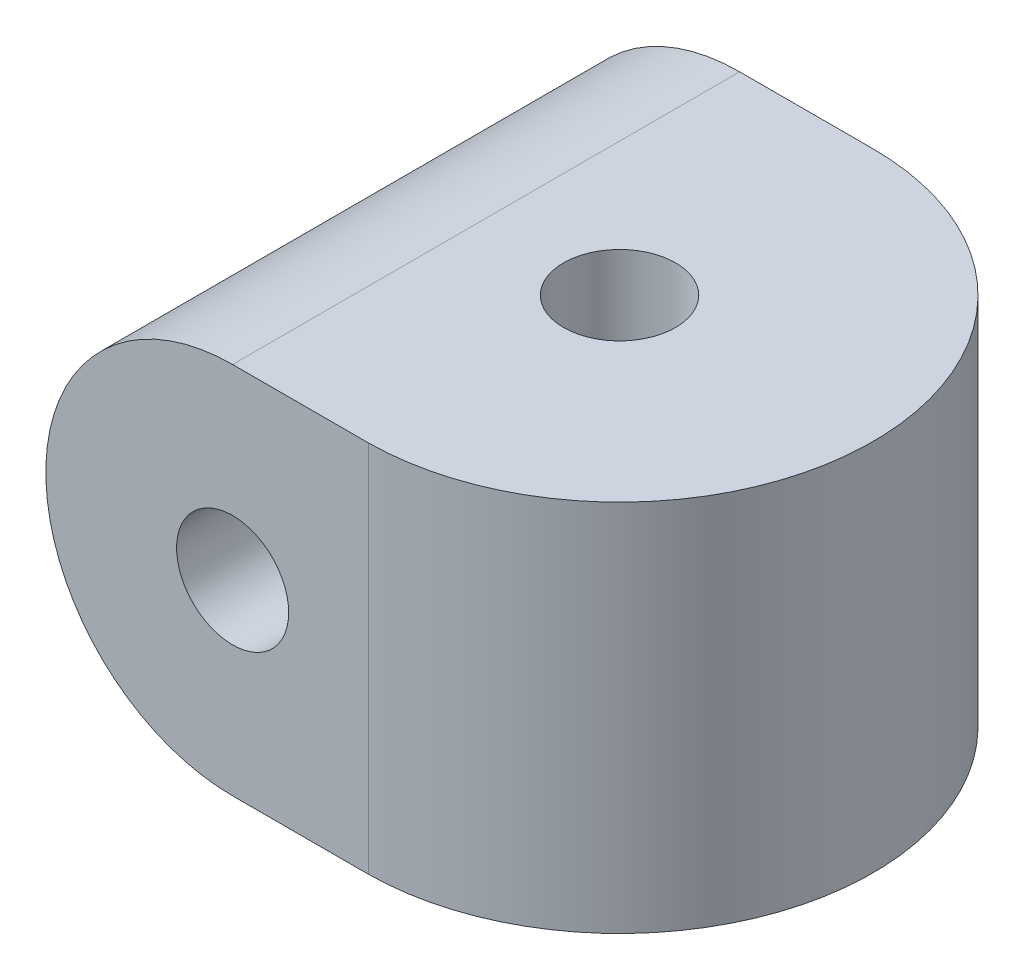
ISO-10303-21;
HEADER;
FILE_DESCRIPTION(('STEP AP214'),'2;1');
FILE_NAME('part.step','',(''),(''),'','','');
FILE_SCHEMA(('AUTOMOTIVE_DESIGN { 1 0 10303 214 1 1 1 1 }'));
ENDSEC;
DATA;
#1=APPLICATION_CONTEXT('core data for automotive mechanical design processes');
#2=APPLICATION_PROTOCOL_DEFINITION('international standard','automotive_design',2000,#1);
#3=PRODUCT_CONTEXT('',#1,'mechanical');
#4=PRODUCT('Part','Part','',(#3));
#5=PRODUCT_RELATED_PRODUCT_CATEGORY('part','',(#4));
#6=PRODUCT_DEFINITION_FORMATION('','',#4);
#7=PRODUCT_DEFINITION_CONTEXT('part definition',#1,'design');
#8=PRODUCT_DEFINITION('design','',#6,#7);
#9=PRODUCT_DEFINITION_SHAPE('','',#8);
#10=(LENGTH_UNIT() NAMED_UNIT(*) SI_UNIT(.MILLI.,.METRE.));
#11=(NAMED_UNIT(*) PLANE_ANGLE_UNIT() SI_UNIT($,.RADIAN.));
#12=(NAMED_UNIT(*) SI_UNIT($,.STERADIAN.) SOLID_ANGLE_UNIT());
#13=UNCERTAINTY_MEASURE_WITH_UNIT(LENGTH_MEASURE(1.E-05),#10,'distance_accuracy_value','');
#14=(GEOMETRIC_REPRESENTATION_CONTEXT(3) GLOBAL_UNCERTAINTY_ASSIGNED_CONTEXT((#13)) GLOBAL_UNIT_ASSIGNED_CONTEXT((#10,
#11,#12)) REPRESENTATION_CONTEXT('',''));
#15=CARTESIAN_POINT('',(0.,0.,0.));
#16=DIRECTION('',(0.,0.,1.));
#17=DIRECTION('',(1.,0.,0.));
#18=AXIS2_PLACEMENT_3D('',#15,#16,#17);
#19=CARTESIAN_POINT('',(0.,7.,0.));
#20=DIRECTION('',(0.,-1.,0.));
#21=DIRECTION('',(0.,0.,-1.));
#22=AXIS2_PLACEMENT_3D('',#19,#20,#21);
#23=PLANE('',#22);
#24=CARTESIAN_POINT('',(0.,7.,0.));
#25=DIRECTION('',(0.,1.,0.));
#26=DIRECTION('',(0.,0.,1.));
#27=AXIS2_PLACEMENT_3D('',#24,#25,#26);
#28=CIRCLE('',#27,2.1);
#29=CARTESIAN_POINT('',(0.,7.,2.1));
#30=VERTEX_POINT('',#29);
#31=EDGE_CURVE('E90',#30,#30,#28,.T.);
#32=ORIENTED_EDGE('',*,*,#31,.F.);
#33=EDGE_LOOP('',(#32));
#34=FACE_BOUND('',#33,.T.);
#35=DIRECTION('',(0.,0.,1.));
#36=VECTOR('',#35,1.);
#37=CARTESIAN_POINT('',(-5.,7.,-9.5));
#38=LINE('',#37,#36);
#39=CARTESIAN_POINT('',(-5.,7.,-9.5));
#40=VERTEX_POINT('',#39);
#41=CARTESIAN_POINT('',(-5.,7.,9.49962135554699));
#42=VERTEX_POINT('',#41);
#43=EDGE_CURVE('E110',#40,#42,#38,.T.);
#44=ORIENTED_EDGE('',*,*,#43,.T.);
#45=DIRECTION('',(1.,0.,0.));
#46=VECTOR('',#45,1.);
#47=CARTESIAN_POINT('',(-15.,7.,9.49962135554699));
#48=LINE('',#47,#46);
#49=CARTESIAN_POINT('',(0.0848180478173785,7.,9.49962135554699));
#50=VERTEX_POINT('',#49);
#51=EDGE_CURVE('E61',#42,#50,#48,.T.);
#52=ORIENTED_EDGE('',*,*,#51,.T.);
#53=CARTESIAN_POINT('',(0.,7.,0.));
#54=DIRECTION('',(0.,1.,0.));
#55=DIRECTION('',(0.,0.,-1.));
#56=AXIS2_PLACEMENT_3D('',#53,#54,#55);
#57=CIRCLE('',#56,9.5);
#58=CARTESIAN_POINT('',(0.,7.,-9.5));
#59=VERTEX_POINT('',#58);
#60=EDGE_CURVE('E81',#50,#59,#57,.T.);
#61=ORIENTED_EDGE('',*,*,#60,.T.);
#62=DIRECTION('',(-1.,0.,0.));
#63=VECTOR('',#62,1.);
#64=CARTESIAN_POINT('',(0.,7.,-9.5));
#65=LINE('',#64,#63);
#66=EDGE_CURVE('E98',#59,#40,#65,.T.);
#67=ORIENTED_EDGE('',*,*,#66,.T.);
#68=EDGE_LOOP('',(#44,#52,#61,#67));
#69=FACE_BOUND('',#68,.T.);
#70=ADVANCED_FACE('F37',(#34,#69),#23,.F.);
#71=CARTESIAN_POINT('',(0.,-7.,0.));
#72=DIRECTION('',(0.,-1.,0.));
#73=DIRECTION('',(0.,0.,-1.));
#74=AXIS2_PLACEMENT_3D('',#71,#72,#73);
#75=PLANE('',#74);
#76=CARTESIAN_POINT('',(0.,-7.,0.));
#77=DIRECTION('',(0.,1.,0.));
#78=DIRECTION('',(0.,0.,1.));
#79=AXIS2_PLACEMENT_3D('',#76,#77,#78);
#80=CIRCLE('',#79,2.1);
#81=CARTESIAN_POINT('',(0.,-7.,2.1));
#82=VERTEX_POINT('',#81);
#83=EDGE_CURVE('E94',#82,#82,#80,.T.);
#84=ORIENTED_EDGE('',*,*,#83,.T.);
#85=EDGE_LOOP('',(#84));
#86=FACE_BOUND('',#85,.T.);
#87=DIRECTION('',(1.,0.,0.));
#88=VECTOR('',#87,1.);
#89=CARTESIAN_POINT('',(-15.,-7.,9.49962135554699));
#90=LINE('',#89,#88);
#91=CARTESIAN_POINT('',(-5.,-7.,9.49962135554699));
#92=VERTEX_POINT('',#91);
#93=CARTESIAN_POINT('',(0.0848180478173785,-7.,9.49962135554699));
#94=VERTEX_POINT('',#93);
#95=EDGE_CURVE('E74',#92,#94,#90,.T.);
#96=ORIENTED_EDGE('',*,*,#95,.F.);
#97=DIRECTION('',(0.,0.,1.));
#98=VECTOR('',#97,1.);
#99=CARTESIAN_POINT('',(-5.,-7.,-9.5));
#100=LINE('',#99,#98);
#101=CARTESIAN_POINT('',(-5.,-7.,-9.5));
#102=VERTEX_POINT('',#101);
#103=EDGE_CURVE('E52',#102,#92,#100,.T.);
#104=ORIENTED_EDGE('',*,*,#103,.F.);
#105=DIRECTION('',(-1.,0.,0.));
#106=VECTOR('',#105,1.);
#107=CARTESIAN_POINT('',(0.,-7.,-9.5));
#108=LINE('',#107,#106);
#109=CARTESIAN_POINT('',(0.,-7.,-9.5));
#110=VERTEX_POINT('',#109);
#111=EDGE_CURVE('E82',#110,#102,#108,.T.);
#112=ORIENTED_EDGE('',*,*,#111,.F.);
#113=CARTESIAN_POINT('',(0.,-7.,0.));
#114=DIRECTION('',(0.,1.,0.));
#115=DIRECTION('',(0.,0.,-1.));
#116=AXIS2_PLACEMENT_3D('',#113,#114,#115);
#117=CIRCLE('',#116,9.5);
#118=EDGE_CURVE('E87',#94,#110,#117,.T.);
#119=ORIENTED_EDGE('',*,*,#118,.F.);
#120=EDGE_LOOP('',(#96,#104,#112,#119));
#121=FACE_BOUND('',#120,.T.);
#122=ADVANCED_FACE('F88',(#86,#121),#75,.T.);
#123=CARTESIAN_POINT('',(0.,7.,0.));
#124=DIRECTION('',(0.,-1.,0.));
#125=DIRECTION('',(0.,0.,-1.));
#126=AXIS2_PLACEMENT_3D('',#123,#124,#125);
#127=CYLINDRICAL_SURFACE('',#126,9.5);
#128=ORIENTED_EDGE('',*,*,#118,.T.);
#129=DIRECTION('',(0.,-1.,0.));
#130=VECTOR('',#129,1.);
#131=CARTESIAN_POINT('',(0.,7.,-9.5));
#132=LINE('',#131,#130);
#133=EDGE_CURVE('E11',#59,#110,#132,.T.);
#134=ORIENTED_EDGE('',*,*,#133,.F.);
#135=ORIENTED_EDGE('',*,*,#60,.F.);
#136=DIRECTION('',(0.,-1.,0.));
#137=VECTOR('',#136,1.);
#138=CARTESIAN_POINT('',(0.0848180478173785,7.,9.49962135554699));
#139=LINE('',#138,#137);
#140=EDGE_CURVE('E45',#50,#94,#139,.T.);
#141=ORIENTED_EDGE('',*,*,#140,.T.);
#142=EDGE_LOOP('',(#128,#134,#135,#141));
#143=FACE_BOUND('',#142,.T.);
#144=ADVANCED_FACE('F39',(#143),#127,.T.);
#145=CARTESIAN_POINT('',(0.,7.,-9.5));
#146=DIRECTION('',(0.,0.,1.));
#147=DIRECTION('',(1.,0.,0.));
#148=AXIS2_PLACEMENT_3D('',#145,#146,#147);
#149=PLANE('',#148);
#150=CARTESIAN_POINT('',(-5.,0.,-9.5));
#151=DIRECTION('',(0.,0.,1.));
#152=DIRECTION('',(1.,0.,0.));
#153=AXIS2_PLACEMENT_3D('',#150,#151,#152);
#154=CIRCLE('',#153,2.1);
#155=CARTESIAN_POINT('',(-2.9,0.,-9.5));
#156=VERTEX_POINT('',#155);
#157=EDGE_CURVE('E103',#156,#156,#154,.T.);
#158=ORIENTED_EDGE('',*,*,#157,.T.);
#159=EDGE_LOOP('',(#158));
#160=FACE_BOUND('',#159,.T.);
#161=ORIENTED_EDGE('',*,*,#111,.T.);
#162=CARTESIAN_POINT('',(-5.,0.,-9.5));
#163=DIRECTION('',(0.,0.,-1.));
#164=DIRECTION('',(1.,0.,0.));
#165=AXIS2_PLACEMENT_3D('',#162,#163,#164);
#166=CIRCLE('',#165,7.);
#167=EDGE_CURVE('E112',#102,#40,#166,.T.);
#168=ORIENTED_EDGE('',*,*,#167,.T.);
#169=ORIENTED_EDGE('',*,*,#66,.F.);
#170=ORIENTED_EDGE('',*,*,#133,.T.);
#171=EDGE_LOOP('',(#161,#168,#169,#170));
#172=FACE_BOUND('',#171,.T.);
#173=ADVANCED_FACE('F118',(#160,#172),#149,.F.);
#174=CARTESIAN_POINT('',(-15.,7.,9.49962135554699));
#175=DIRECTION('',(0.,0.,-1.));
#176=DIRECTION('',(-1.,0.,0.));
#177=AXIS2_PLACEMENT_3D('',#174,#175,#176);
#178=PLANE('',#177);
#179=CARTESIAN_POINT('',(-5.,0.,9.49962135554699));
#180=DIRECTION('',(0.,0.,1.));
#181=DIRECTION('',(1.,0.,0.));
#182=AXIS2_PLACEMENT_3D('',#179,#180,#181);
#183=CIRCLE('',#182,2.1);
#184=CARTESIAN_POINT('',(-2.9,0.,9.49962135554699));
#185=VERTEX_POINT('',#184);
#186=EDGE_CURVE('E105',#185,#185,#183,.T.);
#187=ORIENTED_EDGE('',*,*,#186,.F.);
#188=EDGE_LOOP('',(#187));
#189=FACE_BOUND('',#188,.T.);
#190=ORIENTED_EDGE('',*,*,#51,.F.);
#191=CARTESIAN_POINT('',(-5.,0.,9.49962135554699));
#192=DIRECTION('',(0.,0.,-1.));
#193=DIRECTION('',(1.,0.,0.));
#194=AXIS2_PLACEMENT_3D('',#191,#192,#193);
#195=CIRCLE('',#194,7.);
#196=EDGE_CURVE('E78',#92,#42,#195,.T.);
#197=ORIENTED_EDGE('',*,*,#196,.F.);
#198=ORIENTED_EDGE('',*,*,#95,.T.);
#199=ORIENTED_EDGE('',*,*,#140,.F.);
#200=EDGE_LOOP('',(#190,#197,#198,#199));
#201=FACE_BOUND('',#200,.T.);
#202=ADVANCED_FACE('F76',(#189,#201),#178,.F.);
#203=CARTESIAN_POINT('',(0.,7.,0.));
#204=DIRECTION('',(0.,-1.,0.));
#205=DIRECTION('',(0.,0.,-1.));
#206=AXIS2_PLACEMENT_3D('',#203,#204,#205);
#207=CYLINDRICAL_SURFACE('',#206,2.1);
#208=ORIENTED_EDGE('',*,*,#31,.T.);
#209=EDGE_LOOP('',(#208));
#210=FACE_BOUND('',#209,.T.);
#211=ORIENTED_EDGE('',*,*,#83,.F.);
#212=EDGE_LOOP('',(#211));
#213=FACE_BOUND('',#212,.T.);
#214=ADVANCED_FACE('F129',(#210,#213),#207,.F.);
#215=CARTESIAN_POINT('',(-5.,0.,-9.5));
#216=DIRECTION('',(0.,0.,1.));
#217=DIRECTION('',(1.,0.,0.));
#218=AXIS2_PLACEMENT_3D('',#215,#216,#217);
#219=CYLINDRICAL_SURFACE('',#218,2.1);
#220=ORIENTED_EDGE('',*,*,#157,.F.);
#221=EDGE_LOOP('',(#220));
#222=FACE_BOUND('',#221,.T.);
#223=ORIENTED_EDGE('',*,*,#186,.T.);
#224=EDGE_LOOP('',(#223));
#225=FACE_BOUND('',#224,.T.);
#226=ADVANCED_FACE('F124',(#222,#225),#219,.F.);
#227=CARTESIAN_POINT('',(-5.,0.,-9.5));
#228=DIRECTION('',(0.,0.,1.));
#229=DIRECTION('',(1.,0.,0.));
#230=AXIS2_PLACEMENT_3D('',#227,#228,#229);
#231=CYLINDRICAL_SURFACE('',#230,7.);
#232=ORIENTED_EDGE('',*,*,#196,.T.);
#233=ORIENTED_EDGE('',*,*,#43,.F.);
#234=ORIENTED_EDGE('',*,*,#167,.F.);
#235=ORIENTED_EDGE('',*,*,#103,.T.);
#236=EDGE_LOOP('',(#232,#233,#234,#235));
#237=FACE_BOUND('',#236,.T.);
#238=ADVANCED_FACE('F122',(#237),#231,.T.);
#239=CLOSED_SHELL('',(#70,#122,#144,#173,#202,#214,#226,#238));
#240=MANIFOLD_SOLID_BREP('B2',#239);
#241=ADVANCED_BREP_SHAPE_REPRESENTATION('',(#18,#240),#14);
#242=SHAPE_DEFINITION_REPRESENTATION(#9,#241);
ENDSEC;
END-ISO-10303-21;
